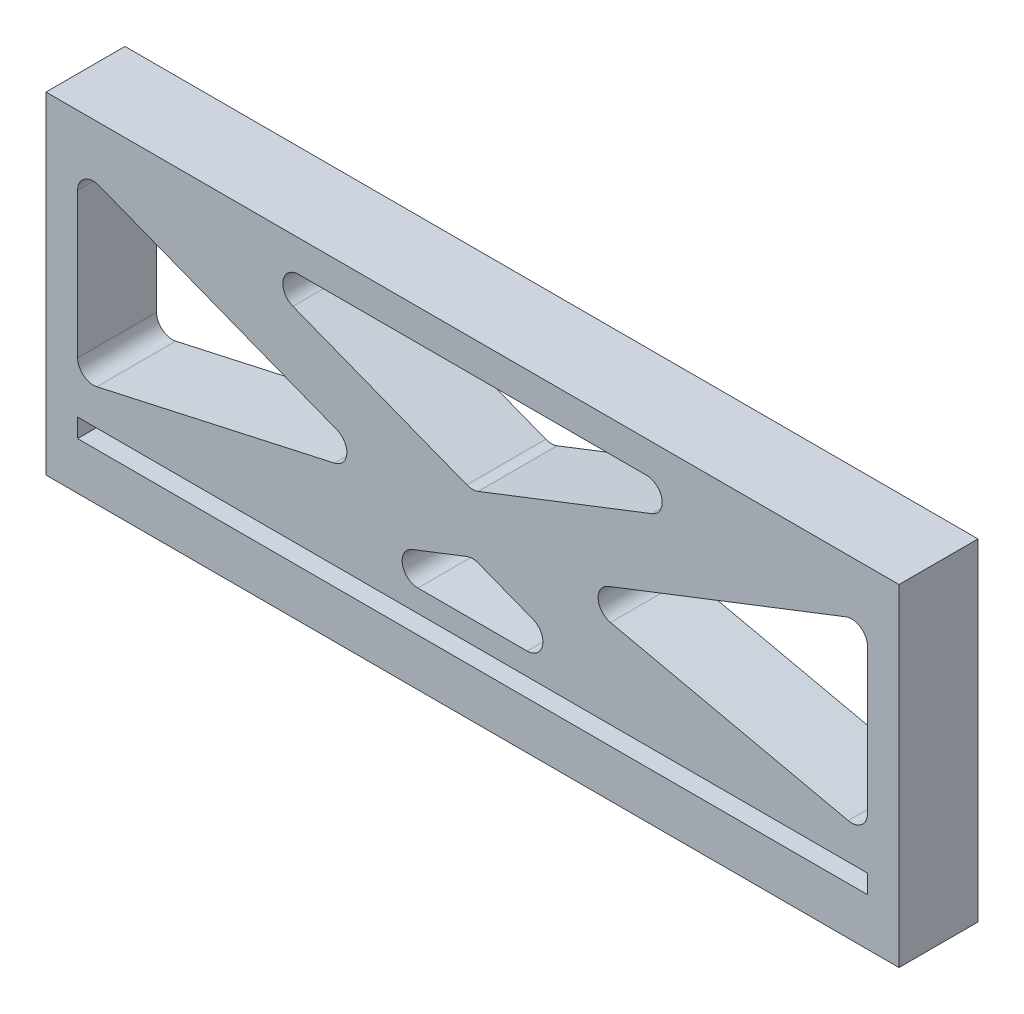
ISO-10303-21;
HEADER;
FILE_DESCRIPTION(('STEP AP214'),'2;1');
FILE_NAME('part.step','',(''),(''),'','','');
FILE_SCHEMA(('AUTOMOTIVE_DESIGN { 1 0 10303 214 1 1 1 1 }'));
ENDSEC;
DATA;
#1=APPLICATION_CONTEXT('core data for automotive mechanical design processes');
#2=APPLICATION_PROTOCOL_DEFINITION('international standard','automotive_design',2000,#1);
#3=PRODUCT_CONTEXT('',#1,'mechanical');
#4=PRODUCT('Part','Part','',(#3));
#5=PRODUCT_RELATED_PRODUCT_CATEGORY('part','',(#4));
#6=PRODUCT_DEFINITION_FORMATION('','',#4);
#7=PRODUCT_DEFINITION_CONTEXT('part definition',#1,'design');
#8=PRODUCT_DEFINITION('design','',#6,#7);
#9=PRODUCT_DEFINITION_SHAPE('','',#8);
#10=(LENGTH_UNIT() NAMED_UNIT(*) SI_UNIT(.MILLI.,.METRE.));
#11=(NAMED_UNIT(*) PLANE_ANGLE_UNIT() SI_UNIT($,.RADIAN.));
#12=(NAMED_UNIT(*) SI_UNIT($,.STERADIAN.) SOLID_ANGLE_UNIT());
#13=UNCERTAINTY_MEASURE_WITH_UNIT(LENGTH_MEASURE(1.E-05),#10,'distance_accuracy_value','');
#14=(GEOMETRIC_REPRESENTATION_CONTEXT(3) GLOBAL_UNCERTAINTY_ASSIGNED_CONTEXT((#13)) GLOBAL_UNIT_ASSIGNED_CONTEXT((#10,
#11,#12)) REPRESENTATION_CONTEXT('',''));
#15=CARTESIAN_POINT('',(0.,0.,0.));
#16=DIRECTION('',(0.,0.,1.));
#17=DIRECTION('',(1.,0.,0.));
#18=AXIS2_PLACEMENT_3D('',#15,#16,#17);
#19=CARTESIAN_POINT('',(0.,0.,6.35));
#20=DIRECTION('',(0.,0.,-1.));
#21=DIRECTION('',(-1.,0.,0.));
#22=AXIS2_PLACEMENT_3D('',#19,#20,#21);
#23=PLANE('',#22);
#24=DIRECTION('',(0.976297538419243,-0.216432706577649,0.));
#25=VECTOR('',#24,1.);
#26=CARTESIAN_POINT('',(31.75,-5.485,6.35));
#27=LINE('',#26,#25);
#28=CARTESIAN_POINT('',(11.0953180998298,-0.906120579293584,6.35));
#29=VERTEX_POINT('',#28);
#30=CARTESIAN_POINT('',(30.2051304626464,-5.14252213631494,6.35));
#31=VERTEX_POINT('',#30);
#32=EDGE_CURVE('E532',#29,#31,#27,.T.);
#33=ORIENTED_EDGE('',*,*,#32,.F.);
#34=CARTESIAN_POINT('',(11.3701876371835,0.333777294498854,6.35));
#35=DIRECTION('',(0.,0.,-1.));
#36=DIRECTION('',(-1.,0.,0.));
#37=AXIS2_PLACEMENT_3D('',#34,#35,#36);
#38=CIRCLE('',#37,1.27);
#39=CARTESIAN_POINT('',(10.9098808855167,1.5174232273563,6.35));
#40=VERTEX_POINT('',#39);
#41=EDGE_CURVE('E445',#29,#40,#38,.T.);
#42=ORIENTED_EDGE('',*,*,#41,.T.);
#43=DIRECTION('',(-0.932004671541298,-0.362446261154944,0.));
#44=VECTOR('',#43,1.);
#45=CARTESIAN_POINT('',(7.00793544374329,0.,6.35));
#46=LINE('',#45,#44);
#47=CARTESIAN_POINT('',(30.0196932483333,8.94901692400708,6.35));
#48=VERTEX_POINT('',#47);
#49=EDGE_CURVE('E541',#48,#40,#46,.T.);
#50=ORIENTED_EDGE('',*,*,#49,.F.);
#51=CARTESIAN_POINT('',(30.48,7.76537099114963,6.35));
#52=DIRECTION('',(0.,0.,-1.));
#53=DIRECTION('',(-1.,0.,0.));
#54=AXIS2_PLACEMENT_3D('',#51,#52,#53);
#55=CIRCLE('',#54,1.27);
#56=CARTESIAN_POINT('',(31.75,7.76537099114963,6.35));
#57=VERTEX_POINT('',#56);
#58=EDGE_CURVE('E433',#48,#57,#55,.T.);
#59=ORIENTED_EDGE('',*,*,#58,.T.);
#60=DIRECTION('',(0.,1.,0.));
#61=VECTOR('',#60,1.);
#62=CARTESIAN_POINT('',(31.75,9.62191399409971,6.35));
#63=LINE('',#62,#61);
#64=CARTESIAN_POINT('',(31.75,-3.9026242625225,6.35));
#65=VERTEX_POINT('',#64);
#66=EDGE_CURVE('E536',#65,#57,#63,.T.);
#67=ORIENTED_EDGE('',*,*,#66,.F.);
#68=CARTESIAN_POINT('',(30.48,-3.9026242625225,6.35));
#69=DIRECTION('',(0.,0.,-1.));
#70=DIRECTION('',(-1.,0.,0.));
#71=AXIS2_PLACEMENT_3D('',#68,#69,#70);
#72=CIRCLE('',#71,1.27);
#73=EDGE_CURVE('E439',#65,#31,#72,.T.);
#74=ORIENTED_EDGE('',*,*,#73,.T.);
#75=EDGE_LOOP('',(#33,#42,#50,#59,#67,#74));
#76=FACE_BOUND('',#75,.T.);
#77=DIRECTION('',(-1.,0.,0.));
#78=VECTOR('',#77,1.);
#79=CARTESIAN_POINT('',(20.7506359848282,10.795,6.35));
#80=LINE('',#79,#78);
#81=CARTESIAN_POINT('',(13.9809539772422,10.795,6.35));
#82=VERTEX_POINT('',#81);
#83=CARTESIAN_POINT('',(-13.9809539772422,10.795,6.35));
#84=VERTEX_POINT('',#83);
#85=EDGE_CURVE('E580',#82,#84,#80,.T.);
#86=ORIENTED_EDGE('',*,*,#85,.F.);
#87=CARTESIAN_POINT('',(13.9809539772422,9.52500000000001,6.35));
#88=DIRECTION('',(0.,0.,-1.));
#89=DIRECTION('',(-1.,0.,0.));
#90=AXIS2_PLACEMENT_3D('',#87,#88,#89);
#91=CIRCLE('',#90,1.27);
#92=CARTESIAN_POINT('',(14.441260728909,8.34135406714256,6.35));
#93=VERTEX_POINT('',#92);
#94=EDGE_CURVE('E451',#82,#93,#91,.T.);
#95=ORIENTED_EDGE('',*,*,#94,.T.);
#96=DIRECTION('',(0.932004671541296,0.362446261154949,0.));
#97=VECTOR('',#96,1.);
#98=CARTESIAN_POINT('',(0.,2.72530822812238,6.35));
#99=LINE('',#98,#97);
#100=CARTESIAN_POINT('',(0.460306751666785,2.90431640932613,6.35));
#101=VERTEX_POINT('',#100);
#102=EDGE_CURVE('E289',#101,#93,#99,.T.);
#103=ORIENTED_EDGE('',*,*,#102,.F.);
#104=CARTESIAN_POINT('',(0.,4.08796234218358,6.35));
#105=DIRECTION('',(0.,0.,-1.));
#106=DIRECTION('',(-1.,0.,0.));
#107=AXIS2_PLACEMENT_3D('',#104,#105,#106);
#108=CIRCLE('',#107,1.27);
#109=CARTESIAN_POINT('',(-0.460306751666785,2.90431640932613,6.35));
#110=VERTEX_POINT('',#109);
#111=EDGE_CURVE('E463',#101,#110,#108,.T.);
#112=ORIENTED_EDGE('',*,*,#111,.T.);
#113=DIRECTION('',(0.932004671541296,-0.362446261154949,0.));
#114=VECTOR('',#113,1.);
#115=CARTESIAN_POINT('',(-20.7506359848282,10.795,6.35));
#116=LINE('',#115,#114);
#117=CARTESIAN_POINT('',(-14.441260728909,8.34135406714256,6.35));
#118=VERTEX_POINT('',#117);
#119=EDGE_CURVE('E584',#118,#110,#116,.T.);
#120=ORIENTED_EDGE('',*,*,#119,.F.);
#121=CARTESIAN_POINT('',(-13.9809539772422,9.52500000000001,6.35));
#122=DIRECTION('',(0.,0.,-1.));
#123=DIRECTION('',(-1.,0.,0.));
#124=AXIS2_PLACEMENT_3D('',#121,#122,#123);
#125=CIRCLE('',#124,1.27);
#126=EDGE_CURVE('E457',#118,#84,#125,.T.);
#127=ORIENTED_EDGE('',*,*,#126,.T.);
#128=EDGE_LOOP('',(#86,#95,#103,#112,#120,#127));
#129=FACE_BOUND('',#128,.T.);
#130=DIRECTION('',(0.,1.,0.));
#131=VECTOR('',#130,1.);
#132=CARTESIAN_POINT('',(34.29,-13.335,6.35));
#133=LINE('',#132,#131);
#134=CARTESIAN_POINT('',(34.29,-13.335,6.35));
#135=VERTEX_POINT('',#134);
#136=CARTESIAN_POINT('',(34.29,13.335,6.35));
#137=VERTEX_POINT('',#136);
#138=EDGE_CURVE('E306',#135,#137,#133,.T.);
#139=ORIENTED_EDGE('',*,*,#138,.T.);
#140=DIRECTION('',(-1.,0.,0.));
#141=VECTOR('',#140,1.);
#142=CARTESIAN_POINT('',(-34.29,13.335,6.35));
#143=LINE('',#142,#141);
#144=CARTESIAN_POINT('',(-34.29,13.335,6.35));
#145=VERTEX_POINT('',#144);
#146=EDGE_CURVE('E310',#137,#145,#143,.T.);
#147=ORIENTED_EDGE('',*,*,#146,.T.);
#148=DIRECTION('',(0.,-1.,0.));
#149=VECTOR('',#148,1.);
#150=CARTESIAN_POINT('',(-34.29,-13.335,6.35));
#151=LINE('',#150,#149);
#152=CARTESIAN_POINT('',(-34.29,-13.335,6.35));
#153=VERTEX_POINT('',#152);
#154=EDGE_CURVE('E314',#145,#153,#151,.T.);
#155=ORIENTED_EDGE('',*,*,#154,.T.);
#156=DIRECTION('',(1.,0.,0.));
#157=VECTOR('',#156,1.);
#158=CARTESIAN_POINT('',(-34.29,-13.335,6.35));
#159=LINE('',#158,#157);
#160=EDGE_CURVE('E317',#153,#135,#159,.T.);
#161=ORIENTED_EDGE('',*,*,#160,.T.);
#162=EDGE_LOOP('',(#139,#147,#155,#161));
#163=FACE_BOUND('',#162,.T.);
#164=DIRECTION('',(0.,1.,0.));
#165=VECTOR('',#164,1.);
#166=CARTESIAN_POINT('',(31.75,-9.525,6.35));
#167=LINE('',#166,#165);
#168=CARTESIAN_POINT('',(31.75,-9.525,6.35));
#169=VERTEX_POINT('',#168);
#170=CARTESIAN_POINT('',(31.75,-8.025,6.35));
#171=VERTEX_POINT('',#170);
#172=EDGE_CURVE('E250',#169,#171,#167,.T.);
#173=ORIENTED_EDGE('',*,*,#172,.F.);
#174=DIRECTION('',(1.,0.,0.));
#175=VECTOR('',#174,1.);
#176=CARTESIAN_POINT('',(-31.75,-9.525,6.35));
#177=LINE('',#176,#175);
#178=CARTESIAN_POINT('',(-31.75,-9.525,6.35));
#179=VERTEX_POINT('',#178);
#180=EDGE_CURVE('E280',#179,#169,#177,.T.);
#181=ORIENTED_EDGE('',*,*,#180,.F.);
#182=DIRECTION('',(0.,-1.,0.));
#183=VECTOR('',#182,1.);
#184=CARTESIAN_POINT('',(-31.75,-9.525,6.35));
#185=LINE('',#184,#183);
#186=CARTESIAN_POINT('',(-31.75,-8.025,6.35));
#187=VERTEX_POINT('',#186);
#188=EDGE_CURVE('E276',#187,#179,#185,.T.);
#189=ORIENTED_EDGE('',*,*,#188,.F.);
#190=DIRECTION('',(-1.,0.,0.));
#191=VECTOR('',#190,1.);
#192=CARTESIAN_POINT('',(-31.75,-8.025,6.35));
#193=LINE('',#192,#191);
#194=EDGE_CURVE('E261',#171,#187,#193,.T.);
#195=ORIENTED_EDGE('',*,*,#194,.F.);
#196=EDGE_LOOP('',(#173,#181,#189,#195));
#197=FACE_BOUND('',#196,.T.);
#198=DIRECTION('',(-0.932004671541296,0.362446261154948,0.));
#199=VECTOR('',#198,1.);
#200=CARTESIAN_POINT('',(-7.0079354437433,0.,6.35));
#201=LINE('',#200,#199);
#202=CARTESIAN_POINT('',(-10.9098808855167,1.51742322735631,6.35));
#203=VERTEX_POINT('',#202);
#204=CARTESIAN_POINT('',(-30.0196932483332,8.94901692400719,6.35));
#205=VERTEX_POINT('',#204);
#206=EDGE_CURVE('E556',#203,#205,#201,.T.);
#207=ORIENTED_EDGE('',*,*,#206,.F.);
#208=CARTESIAN_POINT('',(-11.3701876371834,0.33377729449886,6.35));
#209=DIRECTION('',(0.,0.,-1.));
#210=DIRECTION('',(-1.,0.,0.));
#211=AXIS2_PLACEMENT_3D('',#208,#209,#210);
#212=CIRCLE('',#211,1.27);
#213=CARTESIAN_POINT('',(-11.0953180998298,-0.906120579293582,6.35));
#214=VERTEX_POINT('',#213);
#215=EDGE_CURVE('E469',#203,#214,#212,.T.);
#216=ORIENTED_EDGE('',*,*,#215,.T.);
#217=DIRECTION('',(0.976297538419243,0.216432706577649,0.));
#218=VECTOR('',#217,1.);
#219=CARTESIAN_POINT('',(-31.75,-5.485,6.35));
#220=LINE('',#219,#218);
#221=CARTESIAN_POINT('',(-30.2051304626464,-5.14252213631494,6.35));
#222=VERTEX_POINT('',#221);
#223=EDGE_CURVE('E565',#222,#214,#220,.T.);
#224=ORIENTED_EDGE('',*,*,#223,.F.);
#225=CARTESIAN_POINT('',(-30.48,-3.9026242625225,6.35));
#226=DIRECTION('',(0.,0.,-1.));
#227=DIRECTION('',(-1.,0.,0.));
#228=AXIS2_PLACEMENT_3D('',#225,#226,#227);
#229=CIRCLE('',#228,1.27);
#230=CARTESIAN_POINT('',(-31.75,-3.9026242625225,6.35));
#231=VERTEX_POINT('',#230);
#232=EDGE_CURVE('E481',#222,#231,#229,.T.);
#233=ORIENTED_EDGE('',*,*,#232,.T.);
#234=DIRECTION('',(0.,-1.,0.));
#235=VECTOR('',#234,1.);
#236=CARTESIAN_POINT('',(-31.75,9.62191399409983,6.35));
#237=LINE('',#236,#235);
#238=CARTESIAN_POINT('',(-31.75,7.76537099114975,6.35));
#239=VERTEX_POINT('',#238);
#240=EDGE_CURVE('E560',#239,#231,#237,.T.);
#241=ORIENTED_EDGE('',*,*,#240,.F.);
#242=CARTESIAN_POINT('',(-30.48,7.76537099114975,6.35));
#243=DIRECTION('',(0.,0.,-1.));
#244=DIRECTION('',(-1.,0.,0.));
#245=AXIS2_PLACEMENT_3D('',#242,#243,#244);
#246=CIRCLE('',#245,1.27);
#247=EDGE_CURVE('E475',#239,#205,#246,.T.);
#248=ORIENTED_EDGE('',*,*,#247,.T.);
#249=EDGE_LOOP('',(#207,#216,#224,#233,#241,#248));
#250=FACE_BOUND('',#249,.T.);
#251=DIRECTION('',(-0.932004671541296,0.362446261154948,0.));
#252=VECTOR('',#251,1.);
#253=CARTESIAN_POINT('',(11.158159475094,-6.247,6.35));
#254=LINE('',#253,#252);
#255=CARTESIAN_POINT('',(4.84878421917484,-3.79335406714255,6.35));
#256=VERTEX_POINT('',#255);
#257=CARTESIAN_POINT('',(0.460306751666783,-2.08672394088942,6.35));
#258=VERTEX_POINT('',#257);
#259=EDGE_CURVE('E511',#256,#258,#254,.T.);
#260=ORIENTED_EDGE('',*,*,#259,.F.);
#261=CARTESIAN_POINT('',(4.38847746750805,-4.977,6.35));
#262=DIRECTION('',(0.,0.,-1.));
#263=DIRECTION('',(-1.,0.,0.));
#264=AXIS2_PLACEMENT_3D('',#261,#262,#263);
#265=CIRCLE('',#264,1.27);
#266=CARTESIAN_POINT('',(4.38847746750805,-6.247,6.35));
#267=VERTEX_POINT('',#266);
#268=EDGE_CURVE('E487',#256,#267,#265,.T.);
#269=ORIENTED_EDGE('',*,*,#268,.T.);
#270=DIRECTION('',(1.,0.,0.));
#271=VECTOR('',#270,1.);
#272=CARTESIAN_POINT('',(-11.158159475094,-6.247,6.35));
#273=LINE('',#272,#271);
#274=CARTESIAN_POINT('',(-4.38847746750806,-6.247,6.35));
#275=VERTEX_POINT('',#274);
#276=EDGE_CURVE('E517',#275,#267,#273,.T.);
#277=ORIENTED_EDGE('',*,*,#276,.F.);
#278=CARTESIAN_POINT('',(-4.38847746750806,-4.977,6.35));
#279=DIRECTION('',(0.,0.,-1.));
#280=DIRECTION('',(-1.,0.,0.));
#281=AXIS2_PLACEMENT_3D('',#278,#279,#280);
#282=CIRCLE('',#281,1.27);
#283=CARTESIAN_POINT('',(-4.84878421917484,-3.79335406714255,6.35));
#284=VERTEX_POINT('',#283);
#285=EDGE_CURVE('E11',#275,#284,#282,.T.);
#286=ORIENTED_EDGE('',*,*,#285,.T.);
#287=DIRECTION('',(-0.932004671541296,-0.362446261154948,0.));
#288=VECTOR('',#287,1.);
#289=CARTESIAN_POINT('',(0.,-1.90771575968567,6.35));
#290=LINE('',#289,#288);
#291=CARTESIAN_POINT('',(-0.460306751666786,-2.08672394088942,6.35));
#292=VERTEX_POINT('',#291);
#293=EDGE_CURVE('E514',#292,#284,#290,.T.);
#294=ORIENTED_EDGE('',*,*,#293,.F.);
#295=CARTESIAN_POINT('',(0.,-3.27036987374687,6.35));
#296=DIRECTION('',(0.,0.,-1.));
#297=DIRECTION('',(-1.,0.,0.));
#298=AXIS2_PLACEMENT_3D('',#295,#296,#297);
#299=CIRCLE('',#298,1.27);
#300=EDGE_CURVE('E493',#292,#258,#299,.T.);
#301=ORIENTED_EDGE('',*,*,#300,.T.);
#302=EDGE_LOOP('',(#260,#269,#277,#286,#294,#301));
#303=FACE_BOUND('',#302,.T.);
#304=ADVANCED_FACE('F39',(#76,#129,#163,#197,#250,#303),#23,.F.);
#305=CARTESIAN_POINT('',(0.,0.,0.));
#306=DIRECTION('',(0.,0.,-1.));
#307=DIRECTION('',(-1.,0.,0.));
#308=AXIS2_PLACEMENT_3D('',#305,#306,#307);
#309=PLANE('',#308);
#310=DIRECTION('',(0.,1.,0.));
#311=VECTOR('',#310,1.);
#312=CARTESIAN_POINT('',(34.29,-13.335,0.));
#313=LINE('',#312,#311);
#314=CARTESIAN_POINT('',(34.29,-13.335,0.));
#315=VERTEX_POINT('',#314);
#316=CARTESIAN_POINT('',(34.29,13.335,0.));
#317=VERTEX_POINT('',#316);
#318=EDGE_CURVE('E270',#315,#317,#313,.T.);
#319=ORIENTED_EDGE('',*,*,#318,.F.);
#320=DIRECTION('',(1.,0.,0.));
#321=VECTOR('',#320,1.);
#322=CARTESIAN_POINT('',(-34.29,-13.335,0.));
#323=LINE('',#322,#321);
#324=CARTESIAN_POINT('',(-34.29,-13.335,0.));
#325=VERTEX_POINT('',#324);
#326=EDGE_CURVE('E311',#325,#315,#323,.T.);
#327=ORIENTED_EDGE('',*,*,#326,.F.);
#328=DIRECTION('',(0.,-1.,0.));
#329=VECTOR('',#328,1.);
#330=CARTESIAN_POINT('',(-34.29,-13.335,0.));
#331=LINE('',#330,#329);
#332=CARTESIAN_POINT('',(-34.29,13.335,0.));
#333=VERTEX_POINT('',#332);
#334=EDGE_CURVE('E327',#333,#325,#331,.T.);
#335=ORIENTED_EDGE('',*,*,#334,.F.);
#336=DIRECTION('',(-1.,0.,0.));
#337=VECTOR('',#336,1.);
#338=CARTESIAN_POINT('',(-34.29,13.335,0.));
#339=LINE('',#338,#337);
#340=EDGE_CURVE('E324',#317,#333,#339,.T.);
#341=ORIENTED_EDGE('',*,*,#340,.F.);
#342=EDGE_LOOP('',(#319,#327,#335,#341));
#343=FACE_BOUND('',#342,.T.);
#344=DIRECTION('',(1.,0.,0.));
#345=VECTOR('',#344,1.);
#346=CARTESIAN_POINT('',(-31.75,-9.525,0.));
#347=LINE('',#346,#345);
#348=CARTESIAN_POINT('',(-31.75,-9.525,0.));
#349=VERTEX_POINT('',#348);
#350=CARTESIAN_POINT('',(31.75,-9.525,0.));
#351=VERTEX_POINT('',#350);
#352=EDGE_CURVE('E262',#349,#351,#347,.T.);
#353=ORIENTED_EDGE('',*,*,#352,.T.);
#354=DIRECTION('',(0.,1.,0.));
#355=VECTOR('',#354,1.);
#356=CARTESIAN_POINT('',(31.75,-9.525,0.));
#357=LINE('',#356,#355);
#358=CARTESIAN_POINT('',(31.75,-8.025,0.));
#359=VERTEX_POINT('',#358);
#360=EDGE_CURVE('E286',#351,#359,#357,.T.);
#361=ORIENTED_EDGE('',*,*,#360,.T.);
#362=DIRECTION('',(-1.,0.,0.));
#363=VECTOR('',#362,1.);
#364=CARTESIAN_POINT('',(-31.75,-8.025,0.));
#365=LINE('',#364,#363);
#366=CARTESIAN_POINT('',(-31.75,-8.025,0.));
#367=VERTEX_POINT('',#366);
#368=EDGE_CURVE('E268',#359,#367,#365,.T.);
#369=ORIENTED_EDGE('',*,*,#368,.T.);
#370=DIRECTION('',(0.,-1.,0.));
#371=VECTOR('',#370,1.);
#372=CARTESIAN_POINT('',(-31.75,-9.525,0.));
#373=LINE('',#372,#371);
#374=EDGE_CURVE('E292',#367,#349,#373,.T.);
#375=ORIENTED_EDGE('',*,*,#374,.T.);
#376=EDGE_LOOP('',(#353,#361,#369,#375));
#377=FACE_BOUND('',#376,.T.);
#378=DIRECTION('',(0.932004671541296,-0.362446261154949,0.));
#379=VECTOR('',#378,1.);
#380=CARTESIAN_POINT('',(-20.7506359848282,10.795,0.));
#381=LINE('',#380,#379);
#382=CARTESIAN_POINT('',(-14.441260728909,8.34135406714256,0.));
#383=VERTEX_POINT('',#382);
#384=CARTESIAN_POINT('',(-0.460306751666785,2.90431640932613,0.));
#385=VERTEX_POINT('',#384);
#386=EDGE_CURVE('E595',#383,#385,#381,.T.);
#387=ORIENTED_EDGE('',*,*,#386,.T.);
#388=CARTESIAN_POINT('',(0.,4.08796234218358,0.));
#389=DIRECTION('',(0.,0.,-1.));
#390=DIRECTION('',(-1.,0.,0.));
#391=AXIS2_PLACEMENT_3D('',#388,#389,#390);
#392=CIRCLE('',#391,1.27);
#393=CARTESIAN_POINT('',(0.460306751666785,2.90431640932613,0.));
#394=VERTEX_POINT('',#393);
#395=EDGE_CURVE('E460',#385,#394,#392,.F.);
#396=ORIENTED_EDGE('',*,*,#395,.T.);
#397=DIRECTION('',(0.932004671541296,0.362446261154949,0.));
#398=VECTOR('',#397,1.);
#399=CARTESIAN_POINT('',(0.,2.72530822812238,0.));
#400=LINE('',#399,#398);
#401=CARTESIAN_POINT('',(14.441260728909,8.34135406714256,0.));
#402=VERTEX_POINT('',#401);
#403=EDGE_CURVE('E585',#394,#402,#400,.T.);
#404=ORIENTED_EDGE('',*,*,#403,.T.);
#405=CARTESIAN_POINT('',(13.9809539772422,9.52500000000001,0.));
#406=DIRECTION('',(0.,0.,-1.));
#407=DIRECTION('',(-1.,0.,0.));
#408=AXIS2_PLACEMENT_3D('',#405,#406,#407);
#409=CIRCLE('',#408,1.27);
#410=CARTESIAN_POINT('',(13.9809539772422,10.795,0.));
#411=VERTEX_POINT('',#410);
#412=EDGE_CURVE('E448',#402,#411,#409,.F.);
#413=ORIENTED_EDGE('',*,*,#412,.T.);
#414=DIRECTION('',(-1.,0.,0.));
#415=VECTOR('',#414,1.);
#416=CARTESIAN_POINT('',(20.7506359848282,10.795,0.));
#417=LINE('',#416,#415);
#418=CARTESIAN_POINT('',(-13.9809539772422,10.795,0.));
#419=VERTEX_POINT('',#418);
#420=EDGE_CURVE('E569',#411,#419,#417,.T.);
#421=ORIENTED_EDGE('',*,*,#420,.T.);
#422=CARTESIAN_POINT('',(-13.9809539772422,9.52500000000001,0.));
#423=DIRECTION('',(0.,0.,-1.));
#424=DIRECTION('',(-1.,0.,0.));
#425=AXIS2_PLACEMENT_3D('',#422,#423,#424);
#426=CIRCLE('',#425,1.27);
#427=EDGE_CURVE('E454',#419,#383,#426,.F.);
#428=ORIENTED_EDGE('',*,*,#427,.T.);
#429=EDGE_LOOP('',(#387,#396,#404,#413,#421,#428));
#430=FACE_BOUND('',#429,.T.);
#431=DIRECTION('',(0.,-1.,0.));
#432=VECTOR('',#431,1.);
#433=CARTESIAN_POINT('',(-31.75,9.62191399409983,0.));
#434=LINE('',#433,#432);
#435=CARTESIAN_POINT('',(-31.75,7.76537099114975,0.));
#436=VERTEX_POINT('',#435);
#437=CARTESIAN_POINT('',(-31.75,-3.9026242625225,0.));
#438=VERTEX_POINT('',#437);
#439=EDGE_CURVE('E573',#436,#438,#434,.T.);
#440=ORIENTED_EDGE('',*,*,#439,.T.);
#441=CARTESIAN_POINT('',(-30.48,-3.9026242625225,0.));
#442=DIRECTION('',(0.,0.,-1.));
#443=DIRECTION('',(-1.,0.,0.));
#444=AXIS2_PLACEMENT_3D('',#441,#442,#443);
#445=CIRCLE('',#444,1.27);
#446=CARTESIAN_POINT('',(-30.2051304626464,-5.14252213631494,0.));
#447=VERTEX_POINT('',#446);
#448=EDGE_CURVE('E478',#438,#447,#445,.F.);
#449=ORIENTED_EDGE('',*,*,#448,.T.);
#450=DIRECTION('',(0.976297538419243,0.216432706577649,0.));
#451=VECTOR('',#450,1.);
#452=CARTESIAN_POINT('',(-31.75,-5.485,0.));
#453=LINE('',#452,#451);
#454=CARTESIAN_POINT('',(-11.0953180998298,-0.906120579293582,0.));
#455=VERTEX_POINT('',#454);
#456=EDGE_CURVE('E561',#447,#455,#453,.T.);
#457=ORIENTED_EDGE('',*,*,#456,.T.);
#458=CARTESIAN_POINT('',(-11.3701876371834,0.33377729449886,0.));
#459=DIRECTION('',(0.,0.,-1.));
#460=DIRECTION('',(-1.,0.,0.));
#461=AXIS2_PLACEMENT_3D('',#458,#459,#460);
#462=CIRCLE('',#461,1.27);
#463=CARTESIAN_POINT('',(-10.9098808855167,1.51742322735631,0.));
#464=VERTEX_POINT('',#463);
#465=EDGE_CURVE('E466',#455,#464,#462,.F.);
#466=ORIENTED_EDGE('',*,*,#465,.T.);
#467=DIRECTION('',(-0.932004671541296,0.362446261154948,0.));
#468=VECTOR('',#467,1.);
#469=CARTESIAN_POINT('',(-7.0079354437433,0.,0.));
#470=LINE('',#469,#468);
#471=CARTESIAN_POINT('',(-30.0196932483332,8.94901692400719,0.));
#472=VERTEX_POINT('',#471);
#473=EDGE_CURVE('E545',#464,#472,#470,.T.);
#474=ORIENTED_EDGE('',*,*,#473,.T.);
#475=CARTESIAN_POINT('',(-30.48,7.76537099114975,0.));
#476=DIRECTION('',(0.,0.,-1.));
#477=DIRECTION('',(-1.,0.,0.));
#478=AXIS2_PLACEMENT_3D('',#475,#476,#477);
#479=CIRCLE('',#478,1.27);
#480=EDGE_CURVE('E472',#472,#436,#479,.F.);
#481=ORIENTED_EDGE('',*,*,#480,.T.);
#482=EDGE_LOOP('',(#440,#449,#457,#466,#474,#481));
#483=FACE_BOUND('',#482,.T.);
#484=DIRECTION('',(0.,1.,0.));
#485=VECTOR('',#484,1.);
#486=CARTESIAN_POINT('',(31.75,9.62191399409971,0.));
#487=LINE('',#486,#485);
#488=CARTESIAN_POINT('',(31.75,-3.9026242625225,0.));
#489=VERTEX_POINT('',#488);
#490=CARTESIAN_POINT('',(31.75,7.76537099114963,0.));
#491=VERTEX_POINT('',#490);
#492=EDGE_CURVE('E549',#489,#491,#487,.T.);
#493=ORIENTED_EDGE('',*,*,#492,.T.);
#494=CARTESIAN_POINT('',(30.48,7.76537099114963,0.));
#495=DIRECTION('',(0.,0.,-1.));
#496=DIRECTION('',(-1.,0.,0.));
#497=AXIS2_PLACEMENT_3D('',#494,#495,#496);
#498=CIRCLE('',#497,1.27);
#499=CARTESIAN_POINT('',(30.0196932483333,8.94901692400708,0.));
#500=VERTEX_POINT('',#499);
#501=EDGE_CURVE('E430',#491,#500,#498,.F.);
#502=ORIENTED_EDGE('',*,*,#501,.T.);
#503=DIRECTION('',(-0.932004671541298,-0.362446261154944,0.));
#504=VECTOR('',#503,1.);
#505=CARTESIAN_POINT('',(7.00793544374329,0.,0.));
#506=LINE('',#505,#504);
#507=CARTESIAN_POINT('',(10.9098808855167,1.5174232273563,0.));
#508=VERTEX_POINT('',#507);
#509=EDGE_CURVE('E537',#500,#508,#506,.T.);
#510=ORIENTED_EDGE('',*,*,#509,.T.);
#511=CARTESIAN_POINT('',(11.3701876371835,0.333777294498854,0.));
#512=DIRECTION('',(0.,0.,-1.));
#513=DIRECTION('',(-1.,0.,0.));
#514=AXIS2_PLACEMENT_3D('',#511,#512,#513);
#515=CIRCLE('',#514,1.27);
#516=CARTESIAN_POINT('',(11.0953180998298,-0.906120579293584,0.));
#517=VERTEX_POINT('',#516);
#518=EDGE_CURVE('E442',#508,#517,#515,.F.);
#519=ORIENTED_EDGE('',*,*,#518,.T.);
#520=DIRECTION('',(0.976297538419243,-0.216432706577649,0.));
#521=VECTOR('',#520,1.);
#522=CARTESIAN_POINT('',(31.75,-5.485,0.));
#523=LINE('',#522,#521);
#524=CARTESIAN_POINT('',(30.2051304626464,-5.14252213631494,0.));
#525=VERTEX_POINT('',#524);
#526=EDGE_CURVE('E521',#517,#525,#523,.T.);
#527=ORIENTED_EDGE('',*,*,#526,.T.);
#528=CARTESIAN_POINT('',(30.48,-3.9026242625225,0.));
#529=DIRECTION('',(0.,0.,-1.));
#530=DIRECTION('',(-1.,0.,0.));
#531=AXIS2_PLACEMENT_3D('',#528,#529,#530);
#532=CIRCLE('',#531,1.27);
#533=EDGE_CURVE('E436',#525,#489,#532,.F.);
#534=ORIENTED_EDGE('',*,*,#533,.T.);
#535=EDGE_LOOP('',(#493,#502,#510,#519,#527,#534));
#536=FACE_BOUND('',#535,.T.);
#537=DIRECTION('',(-0.932004671541296,-0.362446261154948,0.));
#538=VECTOR('',#537,1.);
#539=CARTESIAN_POINT('',(0.,-1.90771575968567,0.));
#540=LINE('',#539,#538);
#541=CARTESIAN_POINT('',(-0.460306751666786,-2.08672394088942,0.));
#542=VERTEX_POINT('',#541);
#543=CARTESIAN_POINT('',(-4.84878421917484,-3.79335406714255,0.));
#544=VERTEX_POINT('',#543);
#545=EDGE_CURVE('E502',#542,#544,#540,.T.);
#546=ORIENTED_EDGE('',*,*,#545,.T.);
#547=CARTESIAN_POINT('',(-4.38847746750806,-4.977,0.));
#548=DIRECTION('',(0.,0.,-1.));
#549=DIRECTION('',(-1.,0.,0.));
#550=AXIS2_PLACEMENT_3D('',#547,#548,#549);
#551=CIRCLE('',#550,1.27);
#552=CARTESIAN_POINT('',(-4.38847746750806,-6.247,0.));
#553=VERTEX_POINT('',#552);
#554=EDGE_CURVE('E48',#544,#553,#551,.F.);
#555=ORIENTED_EDGE('',*,*,#554,.T.);
#556=DIRECTION('',(1.,0.,0.));
#557=VECTOR('',#556,1.);
#558=CARTESIAN_POINT('',(-11.158159475094,-6.247,0.));
#559=LINE('',#558,#557);
#560=CARTESIAN_POINT('',(4.38847746750805,-6.247,0.));
#561=VERTEX_POINT('',#560);
#562=EDGE_CURVE('E501',#553,#561,#559,.T.);
#563=ORIENTED_EDGE('',*,*,#562,.T.);
#564=CARTESIAN_POINT('',(4.38847746750805,-4.977,0.));
#565=DIRECTION('',(0.,0.,-1.));
#566=DIRECTION('',(-1.,0.,0.));
#567=AXIS2_PLACEMENT_3D('',#564,#565,#566);
#568=CIRCLE('',#567,1.27);
#569=CARTESIAN_POINT('',(4.84878421917484,-3.79335406714255,0.));
#570=VERTEX_POINT('',#569);
#571=EDGE_CURVE('E484',#561,#570,#568,.F.);
#572=ORIENTED_EDGE('',*,*,#571,.T.);
#573=DIRECTION('',(-0.932004671541296,0.362446261154948,0.));
#574=VECTOR('',#573,1.);
#575=CARTESIAN_POINT('',(11.158159475094,-6.247,0.));
#576=LINE('',#575,#574);
#577=CARTESIAN_POINT('',(0.460306751666783,-2.08672394088942,0.));
#578=VERTEX_POINT('',#577);
#579=EDGE_CURVE('E526',#570,#578,#576,.T.);
#580=ORIENTED_EDGE('',*,*,#579,.T.);
#581=CARTESIAN_POINT('',(0.,-3.27036987374687,0.));
#582=DIRECTION('',(0.,0.,-1.));
#583=DIRECTION('',(-1.,0.,0.));
#584=AXIS2_PLACEMENT_3D('',#581,#582,#583);
#585=CIRCLE('',#584,1.27);
#586=EDGE_CURVE('E490',#578,#542,#585,.F.);
#587=ORIENTED_EDGE('',*,*,#586,.T.);
#588=EDGE_LOOP('',(#546,#555,#563,#572,#580,#587));
#589=FACE_BOUND('',#588,.T.);
#590=ADVANCED_FACE('F500',(#343,#377,#430,#483,#536,#589),#309,.T.);
#591=CARTESIAN_POINT('',(34.29,-13.335,6.35));
#592=DIRECTION('',(-1.,0.,0.));
#593=DIRECTION('',(0.,0.,1.));
#594=AXIS2_PLACEMENT_3D('',#591,#592,#593);
#595=PLANE('',#594);
#596=ORIENTED_EDGE('',*,*,#318,.T.);
#597=DIRECTION('',(0.,0.,-1.));
#598=VECTOR('',#597,1.);
#599=CARTESIAN_POINT('',(34.29,13.335,6.35));
#600=LINE('',#599,#598);
#601=EDGE_CURVE('E343',#137,#317,#600,.T.);
#602=ORIENTED_EDGE('',*,*,#601,.F.);
#603=ORIENTED_EDGE('',*,*,#138,.F.);
#604=DIRECTION('',(0.,0.,-1.));
#605=VECTOR('',#604,1.);
#606=CARTESIAN_POINT('',(34.29,-13.335,6.35));
#607=LINE('',#606,#605);
#608=EDGE_CURVE('E320',#135,#315,#607,.T.);
#609=ORIENTED_EDGE('',*,*,#608,.T.);
#610=EDGE_LOOP('',(#596,#602,#603,#609));
#611=FACE_BOUND('',#610,.T.);
#612=ADVANCED_FACE('F648',(#611),#595,.F.);
#613=CARTESIAN_POINT('',(-34.29,13.335,6.35));
#614=DIRECTION('',(0.,-1.,0.));
#615=DIRECTION('',(0.,0.,-1.));
#616=AXIS2_PLACEMENT_3D('',#613,#614,#615);
#617=PLANE('',#616);
#618=ORIENTED_EDGE('',*,*,#340,.T.);
#619=DIRECTION('',(0.,0.,-1.));
#620=VECTOR('',#619,1.);
#621=CARTESIAN_POINT('',(-34.29,13.335,6.35));
#622=LINE('',#621,#620);
#623=EDGE_CURVE('E339',#145,#333,#622,.T.);
#624=ORIENTED_EDGE('',*,*,#623,.F.);
#625=ORIENTED_EDGE('',*,*,#146,.F.);
#626=ORIENTED_EDGE('',*,*,#601,.T.);
#627=EDGE_LOOP('',(#618,#624,#625,#626));
#628=FACE_BOUND('',#627,.T.);
#629=ADVANCED_FACE('F662',(#628),#617,.F.);
#630=CARTESIAN_POINT('',(-34.29,-13.335,6.35));
#631=DIRECTION('',(1.,0.,0.));
#632=DIRECTION('',(0.,0.,-1.));
#633=AXIS2_PLACEMENT_3D('',#630,#631,#632);
#634=PLANE('',#633);
#635=ORIENTED_EDGE('',*,*,#334,.T.);
#636=DIRECTION('',(0.,0.,-1.));
#637=VECTOR('',#636,1.);
#638=CARTESIAN_POINT('',(-34.29,-13.335,6.35));
#639=LINE('',#638,#637);
#640=EDGE_CURVE('E335',#153,#325,#639,.T.);
#641=ORIENTED_EDGE('',*,*,#640,.F.);
#642=ORIENTED_EDGE('',*,*,#154,.F.);
#643=ORIENTED_EDGE('',*,*,#623,.T.);
#644=EDGE_LOOP('',(#635,#641,#642,#643));
#645=FACE_BOUND('',#644,.T.);
#646=ADVANCED_FACE('F658',(#645),#634,.F.);
#647=CARTESIAN_POINT('',(-34.29,-13.335,6.35));
#648=DIRECTION('',(0.,1.,0.));
#649=DIRECTION('',(-1.,0.,0.));
#650=AXIS2_PLACEMENT_3D('',#647,#648,#649);
#651=PLANE('',#650);
#652=ORIENTED_EDGE('',*,*,#326,.T.);
#653=ORIENTED_EDGE('',*,*,#608,.F.);
#654=ORIENTED_EDGE('',*,*,#160,.F.);
#655=ORIENTED_EDGE('',*,*,#640,.T.);
#656=EDGE_LOOP('',(#652,#653,#654,#655));
#657=FACE_BOUND('',#656,.T.);
#658=ADVANCED_FACE('F655',(#657),#651,.F.);
#659=CARTESIAN_POINT('',(31.75,-9.525,6.35));
#660=DIRECTION('',(-1.,0.,0.));
#661=DIRECTION('',(0.,-1.,0.));
#662=AXIS2_PLACEMENT_3D('',#659,#660,#661);
#663=PLANE('',#662);
#664=ORIENTED_EDGE('',*,*,#360,.F.);
#665=DIRECTION('',(0.,0.,-1.));
#666=VECTOR('',#665,1.);
#667=CARTESIAN_POINT('',(31.75,-9.525,6.35));
#668=LINE('',#667,#666);
#669=EDGE_CURVE('E256',#169,#351,#668,.T.);
#670=ORIENTED_EDGE('',*,*,#669,.F.);
#671=ORIENTED_EDGE('',*,*,#172,.T.);
#672=DIRECTION('',(0.,0.,-1.));
#673=VECTOR('',#672,1.);
#674=CARTESIAN_POINT('',(31.75,-8.025,6.35));
#675=LINE('',#674,#673);
#676=EDGE_CURVE('E253',#171,#359,#675,.T.);
#677=ORIENTED_EDGE('',*,*,#676,.T.);
#678=EDGE_LOOP('',(#664,#670,#671,#677));
#679=FACE_BOUND('',#678,.T.);
#680=ADVANCED_FACE('F252',(#679),#663,.T.);
#681=CARTESIAN_POINT('',(-31.75,-8.025,6.35));
#682=DIRECTION('',(0.,-1.,0.));
#683=DIRECTION('',(0.,0.,-1.));
#684=AXIS2_PLACEMENT_3D('',#681,#682,#683);
#685=PLANE('',#684);
#686=ORIENTED_EDGE('',*,*,#368,.F.);
#687=ORIENTED_EDGE('',*,*,#676,.F.);
#688=ORIENTED_EDGE('',*,*,#194,.T.);
#689=DIRECTION('',(0.,0.,-1.));
#690=VECTOR('',#689,1.);
#691=CARTESIAN_POINT('',(-31.75,-8.025,6.35));
#692=LINE('',#691,#690);
#693=EDGE_CURVE('E271',#187,#367,#692,.T.);
#694=ORIENTED_EDGE('',*,*,#693,.T.);
#695=EDGE_LOOP('',(#686,#687,#688,#694));
#696=FACE_BOUND('',#695,.T.);
#697=ADVANCED_FACE('F265',(#696),#685,.T.);
#698=CARTESIAN_POINT('',(-31.75,-9.525,6.35));
#699=DIRECTION('',(1.,0.,0.));
#700=DIRECTION('',(0.,1.,0.));
#701=AXIS2_PLACEMENT_3D('',#698,#699,#700);
#702=PLANE('',#701);
#703=ORIENTED_EDGE('',*,*,#374,.F.);
#704=ORIENTED_EDGE('',*,*,#693,.F.);
#705=ORIENTED_EDGE('',*,*,#188,.T.);
#706=DIRECTION('',(0.,0.,-1.));
#707=VECTOR('',#706,1.);
#708=CARTESIAN_POINT('',(-31.75,-9.525,6.35));
#709=LINE('',#708,#707);
#710=EDGE_CURVE('E301',#179,#349,#709,.T.);
#711=ORIENTED_EDGE('',*,*,#710,.T.);
#712=EDGE_LOOP('',(#703,#704,#705,#711));
#713=FACE_BOUND('',#712,.T.);
#714=ADVANCED_FACE('F731',(#713),#702,.T.);
#715=CARTESIAN_POINT('',(-31.75,-9.525,6.35));
#716=DIRECTION('',(0.,1.,0.));
#717=DIRECTION('',(0.,0.,1.));
#718=AXIS2_PLACEMENT_3D('',#715,#716,#717);
#719=PLANE('',#718);
#720=ORIENTED_EDGE('',*,*,#352,.F.);
#721=ORIENTED_EDGE('',*,*,#710,.F.);
#722=ORIENTED_EDGE('',*,*,#180,.T.);
#723=ORIENTED_EDGE('',*,*,#669,.T.);
#724=EDGE_LOOP('',(#720,#721,#722,#723));
#725=FACE_BOUND('',#724,.T.);
#726=ADVANCED_FACE('F728',(#725),#719,.T.);
#727=CARTESIAN_POINT('',(20.7506359848282,10.795,6.35));
#728=DIRECTION('',(0.,-1.,0.));
#729=DIRECTION('',(0.,0.,-1.));
#730=AXIS2_PLACEMENT_3D('',#727,#728,#729);
#731=PLANE('',#730);
#732=ORIENTED_EDGE('',*,*,#420,.F.);
#733=DIRECTION('',(0.,0.,-1.));
#734=VECTOR('',#733,1.);
#735=CARTESIAN_POINT('',(13.9809539772422,10.795,6.35));
#736=LINE('',#735,#734);
#737=EDGE_CURVE('E379',#411,#82,#736,.F.);
#738=ORIENTED_EDGE('',*,*,#737,.T.);
#739=ORIENTED_EDGE('',*,*,#85,.T.);
#740=DIRECTION('',(0.,0.,-1.));
#741=VECTOR('',#740,1.);
#742=CARTESIAN_POINT('',(-13.9809539772422,10.795,0.));
#743=LINE('',#742,#741);
#744=EDGE_CURVE('E375',#84,#419,#743,.T.);
#745=ORIENTED_EDGE('',*,*,#744,.T.);
#746=EDGE_LOOP('',(#732,#738,#739,#745));
#747=FACE_BOUND('',#746,.T.);
#748=ADVANCED_FACE('F627',(#747),#731,.T.);
#749=CARTESIAN_POINT('',(-20.7506359848282,10.795,6.35));
#750=DIRECTION('',(0.362446261154949,0.932004671541296,0.));
#751=DIRECTION('',(-0.932004671541296,0.362446261154949,0.));
#752=AXIS2_PLACEMENT_3D('',#749,#750,#751);
#753=PLANE('',#752);
#754=ORIENTED_EDGE('',*,*,#386,.F.);
#755=DIRECTION('',(0.,0.,-1.));
#756=VECTOR('',#755,1.);
#757=CARTESIAN_POINT('',(-14.441260728909,8.34135406714256,6.35));
#758=LINE('',#757,#756);
#759=EDGE_CURVE('E386',#383,#118,#758,.F.);
#760=ORIENTED_EDGE('',*,*,#759,.T.);
#761=ORIENTED_EDGE('',*,*,#119,.T.);
#762=DIRECTION('',(0.,0.,-1.));
#763=VECTOR('',#762,1.);
#764=CARTESIAN_POINT('',(-0.460306751666785,2.90431640932613,0.));
#765=LINE('',#764,#763);
#766=EDGE_CURVE('E382',#110,#385,#765,.T.);
#767=ORIENTED_EDGE('',*,*,#766,.T.);
#768=EDGE_LOOP('',(#754,#760,#761,#767));
#769=FACE_BOUND('',#768,.T.);
#770=ADVANCED_FACE('F620',(#769),#753,.T.);
#771=CARTESIAN_POINT('',(0.,2.72530822812238,6.35));
#772=DIRECTION('',(-0.362446261154949,0.932004671541296,0.));
#773=DIRECTION('',(-0.932004671541296,-0.362446261154949,0.));
#774=AXIS2_PLACEMENT_3D('',#771,#772,#773);
#775=PLANE('',#774);
#776=ORIENTED_EDGE('',*,*,#102,.T.);
#777=DIRECTION('',(0.,0.,-1.));
#778=VECTOR('',#777,1.);
#779=CARTESIAN_POINT('',(14.441260728909,8.34135406714256,0.));
#780=LINE('',#779,#778);
#781=EDGE_CURVE('E371',#93,#402,#780,.T.);
#782=ORIENTED_EDGE('',*,*,#781,.T.);
#783=ORIENTED_EDGE('',*,*,#403,.F.);
#784=DIRECTION('',(0.,0.,-1.));
#785=VECTOR('',#784,1.);
#786=CARTESIAN_POINT('',(0.460306751666785,2.90431640932613,6.35));
#787=LINE('',#786,#785);
#788=EDGE_CURVE('E368',#394,#101,#787,.F.);
#789=ORIENTED_EDGE('',*,*,#788,.T.);
#790=EDGE_LOOP('',(#776,#782,#783,#789));
#791=FACE_BOUND('',#790,.T.);
#792=ADVANCED_FACE('F606',(#791),#775,.T.);
#793=CARTESIAN_POINT('',(-7.0079354437433,0.,6.35));
#794=DIRECTION('',(-0.362446261154948,-0.932004671541296,0.));
#795=DIRECTION('',(0.932004671541296,-0.362446261154948,0.));
#796=AXIS2_PLACEMENT_3D('',#793,#794,#795);
#797=PLANE('',#796);
#798=ORIENTED_EDGE('',*,*,#473,.F.);
#799=DIRECTION('',(0.,0.,-1.));
#800=VECTOR('',#799,1.);
#801=CARTESIAN_POINT('',(-10.9098808855167,1.51742322735631,6.35));
#802=LINE('',#801,#800);
#803=EDGE_CURVE('E400',#464,#203,#802,.F.);
#804=ORIENTED_EDGE('',*,*,#803,.T.);
#805=ORIENTED_EDGE('',*,*,#206,.T.);
#806=DIRECTION('',(0.,0.,-1.));
#807=VECTOR('',#806,1.);
#808=CARTESIAN_POINT('',(-30.0196932483332,8.94901692400719,0.));
#809=LINE('',#808,#807);
#810=EDGE_CURVE('E396',#205,#472,#809,.T.);
#811=ORIENTED_EDGE('',*,*,#810,.T.);
#812=EDGE_LOOP('',(#798,#804,#805,#811));
#813=FACE_BOUND('',#812,.T.);
#814=ADVANCED_FACE('F717',(#813),#797,.T.);
#815=CARTESIAN_POINT('',(-31.75,9.62191399409983,6.35));
#816=DIRECTION('',(1.,0.,0.));
#817=DIRECTION('',(0.,0.,-1.));
#818=AXIS2_PLACEMENT_3D('',#815,#816,#817);
#819=PLANE('',#818);
#820=ORIENTED_EDGE('',*,*,#439,.F.);
#821=DIRECTION('',(0.,0.,-1.));
#822=VECTOR('',#821,1.);
#823=CARTESIAN_POINT('',(-31.75,7.76537099114975,6.35));
#824=LINE('',#823,#822);
#825=EDGE_CURVE('E407',#436,#239,#824,.F.);
#826=ORIENTED_EDGE('',*,*,#825,.T.);
#827=ORIENTED_EDGE('',*,*,#240,.T.);
#828=DIRECTION('',(0.,0.,-1.));
#829=VECTOR('',#828,1.);
#830=CARTESIAN_POINT('',(-31.75,-3.9026242625225,0.));
#831=LINE('',#830,#829);
#832=EDGE_CURVE('E403',#231,#438,#831,.T.);
#833=ORIENTED_EDGE('',*,*,#832,.T.);
#834=EDGE_LOOP('',(#820,#826,#827,#833));
#835=FACE_BOUND('',#834,.T.);
#836=ADVANCED_FACE('F713',(#835),#819,.T.);
#837=CARTESIAN_POINT('',(-31.75,-5.485,6.35));
#838=DIRECTION('',(-0.216432706577649,0.976297538419243,0.));
#839=DIRECTION('',(-0.976297538419243,-0.216432706577649,0.));
#840=AXIS2_PLACEMENT_3D('',#837,#838,#839);
#841=PLANE('',#840);
#842=ORIENTED_EDGE('',*,*,#223,.T.);
#843=DIRECTION('',(0.,0.,-1.));
#844=VECTOR('',#843,1.);
#845=CARTESIAN_POINT('',(-11.0953180998298,-0.90612057929358,0.));
#846=LINE('',#845,#844);
#847=EDGE_CURVE('E392',#214,#455,#846,.T.);
#848=ORIENTED_EDGE('',*,*,#847,.T.);
#849=ORIENTED_EDGE('',*,*,#456,.F.);
#850=DIRECTION('',(0.,0.,-1.));
#851=VECTOR('',#850,1.);
#852=CARTESIAN_POINT('',(-30.2051304626464,-5.14252213631494,6.35));
#853=LINE('',#852,#851);
#854=EDGE_CURVE('E389',#447,#222,#853,.F.);
#855=ORIENTED_EDGE('',*,*,#854,.T.);
#856=EDGE_LOOP('',(#842,#848,#849,#855));
#857=FACE_BOUND('',#856,.T.);
#858=ADVANCED_FACE('F707',(#857),#841,.T.);
#859=CARTESIAN_POINT('',(31.75,-5.485,6.35));
#860=DIRECTION('',(0.216432706577649,0.976297538419243,0.));
#861=DIRECTION('',(-0.976297538419243,0.216432706577649,0.));
#862=AXIS2_PLACEMENT_3D('',#859,#860,#861);
#863=PLANE('',#862);
#864=ORIENTED_EDGE('',*,*,#32,.T.);
#865=DIRECTION('',(0.,0.,-1.));
#866=VECTOR('',#865,1.);
#867=CARTESIAN_POINT('',(30.2051304626464,-5.14252213631494,0.));
#868=LINE('',#867,#866);
#869=EDGE_CURVE('E364',#31,#525,#868,.T.);
#870=ORIENTED_EDGE('',*,*,#869,.T.);
#871=ORIENTED_EDGE('',*,*,#526,.F.);
#872=DIRECTION('',(0.,0.,-1.));
#873=VECTOR('',#872,1.);
#874=CARTESIAN_POINT('',(11.0953180998298,-0.906120579293586,6.35));
#875=LINE('',#874,#873);
#876=EDGE_CURVE('E361',#517,#29,#875,.F.);
#877=ORIENTED_EDGE('',*,*,#876,.T.);
#878=EDGE_LOOP('',(#864,#870,#871,#877));
#879=FACE_BOUND('',#878,.T.);
#880=ADVANCED_FACE('F684',(#879),#863,.T.);
#881=CARTESIAN_POINT('',(31.75,9.62191399409971,6.35));
#882=DIRECTION('',(-1.,0.,0.));
#883=DIRECTION('',(0.,-1.,0.));
#884=AXIS2_PLACEMENT_3D('',#881,#882,#883);
#885=PLANE('',#884);
#886=ORIENTED_EDGE('',*,*,#66,.T.);
#887=DIRECTION('',(0.,0.,-1.));
#888=VECTOR('',#887,1.);
#889=CARTESIAN_POINT('',(31.75,7.76537099114963,0.));
#890=LINE('',#889,#888);
#891=EDGE_CURVE('E350',#57,#491,#890,.T.);
#892=ORIENTED_EDGE('',*,*,#891,.T.);
#893=ORIENTED_EDGE('',*,*,#492,.F.);
#894=DIRECTION('',(0.,0.,-1.));
#895=VECTOR('',#894,1.);
#896=CARTESIAN_POINT('',(31.75,-3.9026242625225,6.35));
#897=LINE('',#896,#895);
#898=EDGE_CURVE('E347',#489,#65,#897,.F.);
#899=ORIENTED_EDGE('',*,*,#898,.T.);
#900=EDGE_LOOP('',(#886,#892,#893,#899));
#901=FACE_BOUND('',#900,.T.);
#902=ADVANCED_FACE('F696',(#901),#885,.T.);
#903=CARTESIAN_POINT('',(7.00793544374329,0.,6.35));
#904=DIRECTION('',(0.362446261154944,-0.932004671541298,0.));
#905=DIRECTION('',(0.932004671541298,0.362446261154944,0.));
#906=AXIS2_PLACEMENT_3D('',#903,#904,#905);
#907=PLANE('',#906);
#908=ORIENTED_EDGE('',*,*,#509,.F.);
#909=DIRECTION('',(0.,0.,-1.));
#910=VECTOR('',#909,1.);
#911=CARTESIAN_POINT('',(30.0196932483333,8.94901692400708,6.35));
#912=LINE('',#911,#910);
#913=EDGE_CURVE('E358',#500,#48,#912,.F.);
#914=ORIENTED_EDGE('',*,*,#913,.T.);
#915=ORIENTED_EDGE('',*,*,#49,.T.);
#916=DIRECTION('',(0.,0.,-1.));
#917=VECTOR('',#916,1.);
#918=CARTESIAN_POINT('',(10.9098808855167,1.5174232273563,0.));
#919=LINE('',#918,#917);
#920=EDGE_CURVE('E354',#40,#508,#919,.T.);
#921=ORIENTED_EDGE('',*,*,#920,.T.);
#922=EDGE_LOOP('',(#908,#914,#915,#921));
#923=FACE_BOUND('',#922,.T.);
#924=ADVANCED_FACE('F692',(#923),#907,.T.);
#925=CARTESIAN_POINT('',(11.158159475094,-6.247,6.35));
#926=DIRECTION('',(-0.362446261154948,-0.932004671541296,0.));
#927=DIRECTION('',(0.932004671541296,-0.362446261154948,0.));
#928=AXIS2_PLACEMENT_3D('',#925,#926,#927);
#929=PLANE('',#928);
#930=ORIENTED_EDGE('',*,*,#579,.F.);
#931=DIRECTION('',(0.,0.,-1.));
#932=VECTOR('',#931,1.);
#933=CARTESIAN_POINT('',(4.84878421917484,-3.79335406714255,6.35));
#934=LINE('',#933,#932);
#935=EDGE_CURVE('E421',#570,#256,#934,.F.);
#936=ORIENTED_EDGE('',*,*,#935,.T.);
#937=ORIENTED_EDGE('',*,*,#259,.T.);
#938=DIRECTION('',(0.,0.,-1.));
#939=VECTOR('',#938,1.);
#940=CARTESIAN_POINT('',(0.460306751666783,-2.08672394088942,0.));
#941=LINE('',#940,#939);
#942=EDGE_CURVE('E417',#258,#578,#941,.T.);
#943=ORIENTED_EDGE('',*,*,#942,.T.);
#944=EDGE_LOOP('',(#930,#936,#937,#943));
#945=FACE_BOUND('',#944,.T.);
#946=ADVANCED_FACE('F705',(#945),#929,.T.);
#947=CARTESIAN_POINT('',(0.,-1.90771575968567,6.35));
#948=DIRECTION('',(0.362446261154948,-0.932004671541296,0.));
#949=DIRECTION('',(0.932004671541296,0.362446261154948,0.));
#950=AXIS2_PLACEMENT_3D('',#947,#948,#949);
#951=PLANE('',#950);
#952=ORIENTED_EDGE('',*,*,#545,.F.);
#953=DIRECTION('',(0.,0.,-1.));
#954=VECTOR('',#953,1.);
#955=CARTESIAN_POINT('',(-0.460306751666786,-2.08672394088942,6.35));
#956=LINE('',#955,#954);
#957=EDGE_CURVE('E60',#542,#292,#956,.F.);
#958=ORIENTED_EDGE('',*,*,#957,.T.);
#959=ORIENTED_EDGE('',*,*,#293,.T.);
#960=DIRECTION('',(0.,0.,-1.));
#961=VECTOR('',#960,1.);
#962=CARTESIAN_POINT('',(-4.84878421917484,-3.79335406714255,0.));
#963=LINE('',#962,#961);
#964=EDGE_CURVE('E424',#284,#544,#963,.T.);
#965=ORIENTED_EDGE('',*,*,#964,.T.);
#966=EDGE_LOOP('',(#952,#958,#959,#965));
#967=FACE_BOUND('',#966,.T.);
#968=ADVANCED_FACE('F513',(#967),#951,.T.);
#969=CARTESIAN_POINT('',(-11.158159475094,-6.247,6.35));
#970=DIRECTION('',(0.,1.,0.));
#971=DIRECTION('',(0.,0.,1.));
#972=AXIS2_PLACEMENT_3D('',#969,#970,#971);
#973=PLANE('',#972);
#974=ORIENTED_EDGE('',*,*,#276,.T.);
#975=DIRECTION('',(0.,0.,-1.));
#976=VECTOR('',#975,1.);
#977=CARTESIAN_POINT('',(4.38847746750805,-6.247,0.));
#978=LINE('',#977,#976);
#979=EDGE_CURVE('E413',#267,#561,#978,.T.);
#980=ORIENTED_EDGE('',*,*,#979,.T.);
#981=ORIENTED_EDGE('',*,*,#562,.F.);
#982=DIRECTION('',(0.,0.,-1.));
#983=VECTOR('',#982,1.);
#984=CARTESIAN_POINT('',(-4.38847746750806,-6.247,6.35));
#985=LINE('',#984,#983);
#986=EDGE_CURVE('E410',#553,#275,#985,.F.);
#987=ORIENTED_EDGE('',*,*,#986,.T.);
#988=EDGE_LOOP('',(#974,#980,#981,#987));
#989=FACE_BOUND('',#988,.T.);
#990=ADVANCED_FACE('F508',(#989),#973,.T.);
#991=CARTESIAN_POINT('',(30.48,7.76537099114963,6.35));
#992=DIRECTION('',(0.,0.,1.));
#993=DIRECTION('',(1.,0.,0.));
#994=AXIS2_PLACEMENT_3D('',#991,#992,#993);
#995=CYLINDRICAL_SURFACE('',#994,1.27);
#996=ORIENTED_EDGE('',*,*,#58,.F.);
#997=ORIENTED_EDGE('',*,*,#913,.F.);
#998=ORIENTED_EDGE('',*,*,#501,.F.);
#999=ORIENTED_EDGE('',*,*,#891,.F.);
#1000=EDGE_LOOP('',(#996,#997,#998,#999));
#1001=FACE_BOUND('',#1000,.T.);
#1002=ADVANCED_FACE('F670',(#1001),#995,.F.);
#1003=CARTESIAN_POINT('',(30.48,-3.9026242625225,6.35));
#1004=DIRECTION('',(0.,0.,1.));
#1005=DIRECTION('',(1.,0.,0.));
#1006=AXIS2_PLACEMENT_3D('',#1003,#1004,#1005);
#1007=CYLINDRICAL_SURFACE('',#1006,1.27);
#1008=ORIENTED_EDGE('',*,*,#73,.F.);
#1009=ORIENTED_EDGE('',*,*,#898,.F.);
#1010=ORIENTED_EDGE('',*,*,#533,.F.);
#1011=ORIENTED_EDGE('',*,*,#869,.F.);
#1012=EDGE_LOOP('',(#1008,#1009,#1010,#1011));
#1013=FACE_BOUND('',#1012,.T.);
#1014=ADVANCED_FACE('F639',(#1013),#1007,.F.);
#1015=CARTESIAN_POINT('',(11.3701876371835,0.333777294498854,6.35));
#1016=DIRECTION('',(0.,0.,1.));
#1017=DIRECTION('',(1.,0.,0.));
#1018=AXIS2_PLACEMENT_3D('',#1015,#1016,#1017);
#1019=CYLINDRICAL_SURFACE('',#1018,1.27);
#1020=ORIENTED_EDGE('',*,*,#41,.F.);
#1021=ORIENTED_EDGE('',*,*,#876,.F.);
#1022=ORIENTED_EDGE('',*,*,#518,.F.);
#1023=ORIENTED_EDGE('',*,*,#920,.F.);
#1024=EDGE_LOOP('',(#1020,#1021,#1022,#1023));
#1025=FACE_BOUND('',#1024,.T.);
#1026=ADVANCED_FACE('F632',(#1025),#1019,.F.);
#1027=CARTESIAN_POINT('',(13.9809539772422,9.52500000000001,6.35));
#1028=DIRECTION('',(0.,0.,1.));
#1029=DIRECTION('',(1.,0.,0.));
#1030=AXIS2_PLACEMENT_3D('',#1027,#1028,#1029);
#1031=CYLINDRICAL_SURFACE('',#1030,1.27);
#1032=ORIENTED_EDGE('',*,*,#94,.F.);
#1033=ORIENTED_EDGE('',*,*,#737,.F.);
#1034=ORIENTED_EDGE('',*,*,#412,.F.);
#1035=ORIENTED_EDGE('',*,*,#781,.F.);
#1036=EDGE_LOOP('',(#1032,#1033,#1034,#1035));
#1037=FACE_BOUND('',#1036,.T.);
#1038=ADVANCED_FACE('F630',(#1037),#1031,.F.);
#1039=CARTESIAN_POINT('',(-13.9809539772422,9.52500000000001,6.35));
#1040=DIRECTION('',(0.,0.,1.));
#1041=DIRECTION('',(1.,0.,0.));
#1042=AXIS2_PLACEMENT_3D('',#1039,#1040,#1041);
#1043=CYLINDRICAL_SURFACE('',#1042,1.27);
#1044=ORIENTED_EDGE('',*,*,#126,.F.);
#1045=ORIENTED_EDGE('',*,*,#759,.F.);
#1046=ORIENTED_EDGE('',*,*,#427,.F.);
#1047=ORIENTED_EDGE('',*,*,#744,.F.);
#1048=EDGE_LOOP('',(#1044,#1045,#1046,#1047));
#1049=FACE_BOUND('',#1048,.T.);
#1050=ADVANCED_FACE('F623',(#1049),#1043,.F.);
#1051=CARTESIAN_POINT('',(0.,4.08796234218358,6.35));
#1052=DIRECTION('',(0.,0.,1.));
#1053=DIRECTION('',(1.,0.,0.));
#1054=AXIS2_PLACEMENT_3D('',#1051,#1052,#1053);
#1055=CYLINDRICAL_SURFACE('',#1054,1.27);
#1056=ORIENTED_EDGE('',*,*,#111,.F.);
#1057=ORIENTED_EDGE('',*,*,#788,.F.);
#1058=ORIENTED_EDGE('',*,*,#395,.F.);
#1059=ORIENTED_EDGE('',*,*,#766,.F.);
#1060=EDGE_LOOP('',(#1056,#1057,#1058,#1059));
#1061=FACE_BOUND('',#1060,.T.);
#1062=ADVANCED_FACE('F611',(#1061),#1055,.F.);
#1063=CARTESIAN_POINT('',(-11.3701876371834,0.33377729449886,6.35));
#1064=DIRECTION('',(0.,0.,1.));
#1065=DIRECTION('',(1.,0.,0.));
#1066=AXIS2_PLACEMENT_3D('',#1063,#1064,#1065);
#1067=CYLINDRICAL_SURFACE('',#1066,1.27);
#1068=ORIENTED_EDGE('',*,*,#215,.F.);
#1069=ORIENTED_EDGE('',*,*,#803,.F.);
#1070=ORIENTED_EDGE('',*,*,#465,.F.);
#1071=ORIENTED_EDGE('',*,*,#847,.F.);
#1072=EDGE_LOOP('',(#1068,#1069,#1070,#1071));
#1073=FACE_BOUND('',#1072,.T.);
#1074=ADVANCED_FACE('F876',(#1073),#1067,.F.);
#1075=CARTESIAN_POINT('',(-30.48,7.76537099114975,6.35));
#1076=DIRECTION('',(0.,0.,1.));
#1077=DIRECTION('',(1.,0.,0.));
#1078=AXIS2_PLACEMENT_3D('',#1075,#1076,#1077);
#1079=CYLINDRICAL_SURFACE('',#1078,1.27);
#1080=ORIENTED_EDGE('',*,*,#247,.F.);
#1081=ORIENTED_EDGE('',*,*,#825,.F.);
#1082=ORIENTED_EDGE('',*,*,#480,.F.);
#1083=ORIENTED_EDGE('',*,*,#810,.F.);
#1084=EDGE_LOOP('',(#1080,#1081,#1082,#1083));
#1085=FACE_BOUND('',#1084,.T.);
#1086=ADVANCED_FACE('F885',(#1085),#1079,.F.);
#1087=CARTESIAN_POINT('',(-30.48,-3.9026242625225,6.35));
#1088=DIRECTION('',(0.,0.,1.));
#1089=DIRECTION('',(1.,0.,0.));
#1090=AXIS2_PLACEMENT_3D('',#1087,#1088,#1089);
#1091=CYLINDRICAL_SURFACE('',#1090,1.27);
#1092=ORIENTED_EDGE('',*,*,#232,.F.);
#1093=ORIENTED_EDGE('',*,*,#854,.F.);
#1094=ORIENTED_EDGE('',*,*,#448,.F.);
#1095=ORIENTED_EDGE('',*,*,#832,.F.);
#1096=EDGE_LOOP('',(#1092,#1093,#1094,#1095));
#1097=FACE_BOUND('',#1096,.T.);
#1098=ADVANCED_FACE('F895',(#1097),#1091,.F.);
#1099=CARTESIAN_POINT('',(4.38847746750805,-4.977,6.35));
#1100=DIRECTION('',(0.,0.,1.));
#1101=DIRECTION('',(1.,0.,0.));
#1102=AXIS2_PLACEMENT_3D('',#1099,#1100,#1101);
#1103=CYLINDRICAL_SURFACE('',#1102,1.27);
#1104=ORIENTED_EDGE('',*,*,#268,.F.);
#1105=ORIENTED_EDGE('',*,*,#935,.F.);
#1106=ORIENTED_EDGE('',*,*,#571,.F.);
#1107=ORIENTED_EDGE('',*,*,#979,.F.);
#1108=EDGE_LOOP('',(#1104,#1105,#1106,#1107));
#1109=FACE_BOUND('',#1108,.T.);
#1110=ADVANCED_FACE('F905',(#1109),#1103,.F.);
#1111=CARTESIAN_POINT('',(0.,-3.27036987374687,6.35));
#1112=DIRECTION('',(0.,0.,1.));
#1113=DIRECTION('',(1.,0.,0.));
#1114=AXIS2_PLACEMENT_3D('',#1111,#1112,#1113);
#1115=CYLINDRICAL_SURFACE('',#1114,1.27);
#1116=ORIENTED_EDGE('',*,*,#300,.F.);
#1117=ORIENTED_EDGE('',*,*,#957,.F.);
#1118=ORIENTED_EDGE('',*,*,#586,.F.);
#1119=ORIENTED_EDGE('',*,*,#942,.F.);
#1120=EDGE_LOOP('',(#1116,#1117,#1118,#1119));
#1121=FACE_BOUND('',#1120,.T.);
#1122=ADVANCED_FACE('F915',(#1121),#1115,.F.);
#1123=CARTESIAN_POINT('',(-4.38847746750806,-4.977,6.35));
#1124=DIRECTION('',(0.,0.,1.));
#1125=DIRECTION('',(1.,0.,0.));
#1126=AXIS2_PLACEMENT_3D('',#1123,#1124,#1125);
#1127=CYLINDRICAL_SURFACE('',#1126,1.27);
#1128=ORIENTED_EDGE('',*,*,#285,.F.);
#1129=ORIENTED_EDGE('',*,*,#986,.F.);
#1130=ORIENTED_EDGE('',*,*,#554,.F.);
#1131=ORIENTED_EDGE('',*,*,#964,.F.);
#1132=EDGE_LOOP('',(#1128,#1129,#1130,#1131));
#1133=FACE_BOUND('',#1132,.T.);
#1134=ADVANCED_FACE('F41',(#1133),#1127,.F.);
#1135=CLOSED_SHELL('',(#304,#590,#612,#629,#646,#658,#680,#697,#714,#726,#748,#770,#792,#814,
#836,#858,#880,#902,#924,#946,#968,#990,#1002,#1014,#1026,#1038,#1050,#1062,#1074,#1086,#1098,
#1110,#1122,#1134));
#1136=MANIFOLD_SOLID_BREP('B2',#1135);
#1137=ADVANCED_BREP_SHAPE_REPRESENTATION('',(#18,#1136),#14);
#1138=SHAPE_DEFINITION_REPRESENTATION(#9,#1137);
ENDSEC;
END-ISO-10303-21;
